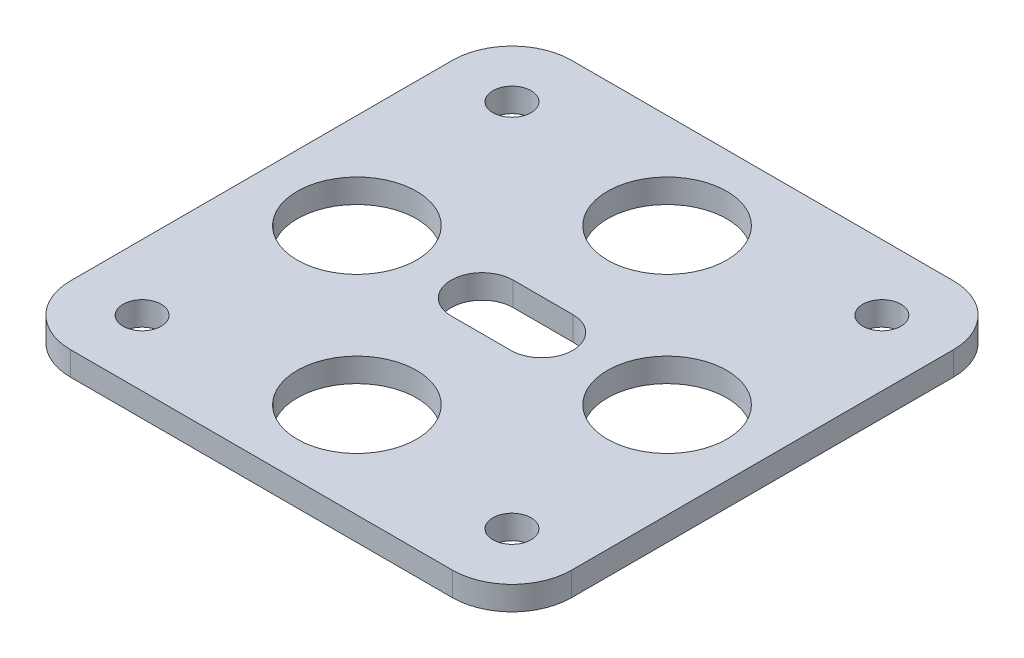
ISO-10303-21;
HEADER;
FILE_DESCRIPTION(('STEP AP214'),'2;1');
FILE_NAME('part.step','',(''),(''),'','','');
FILE_SCHEMA(('AUTOMOTIVE_DESIGN { 1 0 10303 214 1 1 1 1 }'));
ENDSEC;
DATA;
#1=APPLICATION_CONTEXT('core data for automotive mechanical design processes');
#2=APPLICATION_PROTOCOL_DEFINITION('international standard','automotive_design',2000,#1);
#3=PRODUCT_CONTEXT('',#1,'mechanical');
#4=PRODUCT('Part','Part','',(#3));
#5=PRODUCT_RELATED_PRODUCT_CATEGORY('part','',(#4));
#6=PRODUCT_DEFINITION_FORMATION('','',#4);
#7=PRODUCT_DEFINITION_CONTEXT('part definition',#1,'design');
#8=PRODUCT_DEFINITION('design','',#6,#7);
#9=PRODUCT_DEFINITION_SHAPE('','',#8);
#10=(LENGTH_UNIT() NAMED_UNIT(*) SI_UNIT(.MILLI.,.METRE.));
#11=(NAMED_UNIT(*) PLANE_ANGLE_UNIT() SI_UNIT($,.RADIAN.));
#12=(NAMED_UNIT(*) SI_UNIT($,.STERADIAN.) SOLID_ANGLE_UNIT());
#13=UNCERTAINTY_MEASURE_WITH_UNIT(LENGTH_MEASURE(1.E-05),#10,'distance_accuracy_value','');
#14=(GEOMETRIC_REPRESENTATION_CONTEXT(3) GLOBAL_UNCERTAINTY_ASSIGNED_CONTEXT((#13)) GLOBAL_UNIT_ASSIGNED_CONTEXT((#10,
#11,#12)) REPRESENTATION_CONTEXT('',''));
#15=CARTESIAN_POINT('',(0.,0.,0.));
#16=DIRECTION('',(0.,0.,1.));
#17=DIRECTION('',(1.,0.,0.));
#18=AXIS2_PLACEMENT_3D('',#15,#16,#17);
#19=CARTESIAN_POINT('',(0.,2.,0.));
#20=DIRECTION('',(0.,-1.,0.));
#21=DIRECTION('',(0.,0.,-1.));
#22=AXIS2_PLACEMENT_3D('',#19,#20,#21);
#23=PLANE('',#22);
#24=CARTESIAN_POINT('',(-15.5,2.,15.5));
#25=DIRECTION('',(0.,1.,0.));
#26=DIRECTION('',(0.,0.,1.));
#27=AXIS2_PLACEMENT_3D('',#24,#25,#26);
#28=CIRCLE('',#27,1.6);
#29=CARTESIAN_POINT('',(-15.5,2.,17.1));
#30=VERTEX_POINT('',#29);
#31=EDGE_CURVE('E167',#30,#30,#28,.T.);
#32=ORIENTED_EDGE('',*,*,#31,.F.);
#33=EDGE_LOOP('',(#32));
#34=FACE_BOUND('',#33,.T.);
#35=CARTESIAN_POINT('',(15.5,2.,15.5));
#36=DIRECTION('',(0.,1.,0.));
#37=DIRECTION('',(0.,0.,-1.));
#38=AXIS2_PLACEMENT_3D('',#35,#36,#37);
#39=CIRCLE('',#38,1.6);
#40=CARTESIAN_POINT('',(15.5,2.,13.9));
#41=VERTEX_POINT('',#40);
#42=EDGE_CURVE('E173',#41,#41,#39,.T.);
#43=ORIENTED_EDGE('',*,*,#42,.F.);
#44=EDGE_LOOP('',(#43));
#45=FACE_BOUND('',#44,.T.);
#46=CARTESIAN_POINT('',(-15.5,2.,-15.5));
#47=DIRECTION('',(0.,1.,0.));
#48=DIRECTION('',(0.,0.,-1.));
#49=AXIS2_PLACEMENT_3D('',#46,#47,#48);
#50=CIRCLE('',#49,1.6);
#51=CARTESIAN_POINT('',(-15.5,2.,-17.1));
#52=VERTEX_POINT('',#51);
#53=EDGE_CURVE('E179',#52,#52,#50,.T.);
#54=ORIENTED_EDGE('',*,*,#53,.F.);
#55=EDGE_LOOP('',(#54));
#56=FACE_BOUND('',#55,.T.);
#57=CARTESIAN_POINT('',(15.5,2.,-15.5));
#58=DIRECTION('',(0.,1.,0.));
#59=DIRECTION('',(0.,0.,1.));
#60=AXIS2_PLACEMENT_3D('',#57,#58,#59);
#61=CIRCLE('',#60,1.6);
#62=CARTESIAN_POINT('',(15.5,2.,-13.9));
#63=VERTEX_POINT('',#62);
#64=EDGE_CURVE('E185',#63,#63,#61,.T.);
#65=ORIENTED_EDGE('',*,*,#64,.F.);
#66=EDGE_LOOP('',(#65));
#67=FACE_BOUND('',#66,.T.);
#68=DIRECTION('',(-1.,0.,0.));
#69=VECTOR('',#68,1.);
#70=CARTESIAN_POINT('',(-21.,2.,-21.));
#71=LINE('',#70,#69);
#72=CARTESIAN_POINT('',(16.,2.,-21.));
#73=VERTEX_POINT('',#72);
#74=CARTESIAN_POINT('',(-16.,2.,-21.));
#75=VERTEX_POINT('',#74);
#76=EDGE_CURVE('E194',#73,#75,#71,.T.);
#77=ORIENTED_EDGE('',*,*,#76,.T.);
#78=CARTESIAN_POINT('',(-16.,2.,-16.));
#79=DIRECTION('',(0.,-1.,0.));
#80=DIRECTION('',(0.,0.,-1.));
#81=AXIS2_PLACEMENT_3D('',#78,#79,#80);
#82=CIRCLE('',#81,5.);
#83=CARTESIAN_POINT('',(-21.,2.,-16.));
#84=VERTEX_POINT('',#83);
#85=EDGE_CURVE('E234',#75,#84,#82,.F.);
#86=ORIENTED_EDGE('',*,*,#85,.T.);
#87=DIRECTION('',(0.,0.,1.));
#88=VECTOR('',#87,1.);
#89=CARTESIAN_POINT('',(-21.,2.,21.));
#90=LINE('',#89,#88);
#91=CARTESIAN_POINT('',(-21.,2.,16.));
#92=VERTEX_POINT('',#91);
#93=EDGE_CURVE('E198',#84,#92,#90,.T.);
#94=ORIENTED_EDGE('',*,*,#93,.T.);
#95=CARTESIAN_POINT('',(-16.,2.,16.));
#96=DIRECTION('',(0.,-1.,0.));
#97=DIRECTION('',(0.,0.,-1.));
#98=AXIS2_PLACEMENT_3D('',#95,#96,#97);
#99=CIRCLE('',#98,5.);
#100=CARTESIAN_POINT('',(-16.,2.,21.));
#101=VERTEX_POINT('',#100);
#102=EDGE_CURVE('E53',#92,#101,#99,.F.);
#103=ORIENTED_EDGE('',*,*,#102,.T.);
#104=DIRECTION('',(1.,0.,0.));
#105=VECTOR('',#104,1.);
#106=CARTESIAN_POINT('',(-21.,2.,21.));
#107=LINE('',#106,#105);
#108=CARTESIAN_POINT('',(16.,2.,21.));
#109=VERTEX_POINT('',#108);
#110=EDGE_CURVE('E200',#101,#109,#107,.T.);
#111=ORIENTED_EDGE('',*,*,#110,.T.);
#112=CARTESIAN_POINT('',(16.,2.,16.));
#113=DIRECTION('',(0.,-1.,0.));
#114=DIRECTION('',(0.,0.,-1.));
#115=AXIS2_PLACEMENT_3D('',#112,#113,#114);
#116=CIRCLE('',#115,5.);
#117=CARTESIAN_POINT('',(21.,2.,16.));
#118=VERTEX_POINT('',#117);
#119=EDGE_CURVE('E230',#109,#118,#116,.F.);
#120=ORIENTED_EDGE('',*,*,#119,.T.);
#121=DIRECTION('',(0.,0.,-1.));
#122=VECTOR('',#121,1.);
#123=CARTESIAN_POINT('',(21.,2.,21.));
#124=LINE('',#123,#122);
#125=CARTESIAN_POINT('',(21.,2.,-16.));
#126=VERTEX_POINT('',#125);
#127=EDGE_CURVE('E191',#118,#126,#124,.T.);
#128=ORIENTED_EDGE('',*,*,#127,.T.);
#129=CARTESIAN_POINT('',(16.,2.,-16.));
#130=DIRECTION('',(0.,-1.,0.));
#131=DIRECTION('',(0.,0.,-1.));
#132=AXIS2_PLACEMENT_3D('',#129,#130,#131);
#133=CIRCLE('',#132,5.);
#134=EDGE_CURVE('E232',#126,#73,#133,.F.);
#135=ORIENTED_EDGE('',*,*,#134,.T.);
#136=EDGE_LOOP('',(#77,#86,#94,#103,#111,#120,#128,#135));
#137=FACE_BOUND('',#136,.T.);
#138=CARTESIAN_POINT('',(-2.49999999999999,2.,0.));
#139=DIRECTION('',(0.,1.,0.));
#140=DIRECTION('',(0.,0.,1.));
#141=AXIS2_PLACEMENT_3D('',#138,#139,#140);
#142=CIRCLE('',#141,2.6);
#143=CARTESIAN_POINT('',(-2.5,2.,-2.6));
#144=VERTEX_POINT('',#143);
#145=CARTESIAN_POINT('',(-2.5,2.,2.6));
#146=VERTEX_POINT('',#145);
#147=EDGE_CURVE('E123',#144,#146,#142,.T.);
#148=ORIENTED_EDGE('',*,*,#147,.F.);
#149=DIRECTION('',(-1.,0.,0.));
#150=VECTOR('',#149,1.);
#151=CARTESIAN_POINT('',(-2.5,2.,-2.6));
#152=LINE('',#151,#150);
#153=CARTESIAN_POINT('',(2.5,2.,-2.6));
#154=VERTEX_POINT('',#153);
#155=EDGE_CURVE('E149',#154,#144,#152,.T.);
#156=ORIENTED_EDGE('',*,*,#155,.F.);
#157=CARTESIAN_POINT('',(2.5,2.,0.));
#158=DIRECTION('',(0.,1.,0.));
#159=DIRECTION('',(0.,0.,1.));
#160=AXIS2_PLACEMENT_3D('',#157,#158,#159);
#161=CIRCLE('',#160,2.6);
#162=CARTESIAN_POINT('',(2.5,2.,2.6));
#163=VERTEX_POINT('',#162);
#164=EDGE_CURVE('E147',#163,#154,#161,.T.);
#165=ORIENTED_EDGE('',*,*,#164,.F.);
#166=DIRECTION('',(1.,0.,0.));
#167=VECTOR('',#166,1.);
#168=CARTESIAN_POINT('',(-2.5,2.,2.6));
#169=LINE('',#168,#167);
#170=EDGE_CURVE('E133',#146,#163,#169,.T.);
#171=ORIENTED_EDGE('',*,*,#170,.F.);
#172=EDGE_LOOP('',(#148,#156,#165,#171));
#173=FACE_BOUND('',#172,.T.);
#174=CARTESIAN_POINT('',(0.,2.,-13.));
#175=DIRECTION('',(0.,1.,0.));
#176=DIRECTION('',(0.,0.,1.));
#177=AXIS2_PLACEMENT_3D('',#174,#175,#176);
#178=CIRCLE('',#177,5.);
#179=CARTESIAN_POINT('',(0.,2.,-8.));
#180=VERTEX_POINT('',#179);
#181=EDGE_CURVE('E156',#180,#180,#178,.T.);
#182=ORIENTED_EDGE('',*,*,#181,.F.);
#183=EDGE_LOOP('',(#182));
#184=FACE_BOUND('',#183,.T.);
#185=CARTESIAN_POINT('',(13.0000000000003,2.,-3.39652169345829E-13));
#186=DIRECTION('',(0.,1.,0.));
#187=DIRECTION('',(0.,0.,1.));
#188=AXIS2_PLACEMENT_3D('',#185,#186,#187);
#189=CIRCLE('',#188,5.);
#190=CARTESIAN_POINT('',(13.0000000000003,2.,4.99999999999966));
#191=VERTEX_POINT('',#190);
#192=EDGE_CURVE('E505',#191,#191,#189,.T.);
#193=ORIENTED_EDGE('',*,*,#192,.F.);
#194=EDGE_LOOP('',(#193));
#195=FACE_BOUND('',#194,.T.);
#196=CARTESIAN_POINT('',(6.79304338691657E-13,2.,13.));
#197=DIRECTION('',(0.,1.,0.));
#198=DIRECTION('',(0.,0.,1.));
#199=AXIS2_PLACEMENT_3D('',#196,#197,#198);
#200=CIRCLE('',#199,5.);
#201=CARTESIAN_POINT('',(6.79304338691657E-13,2.,18.));
#202=VERTEX_POINT('',#201);
#203=EDGE_CURVE('E500',#202,#202,#200,.T.);
#204=ORIENTED_EDGE('',*,*,#203,.F.);
#205=EDGE_LOOP('',(#204));
#206=FACE_BOUND('',#205,.T.);
#207=CARTESIAN_POINT('',(-12.9999999999997,2.,3.4124421018472E-13));
#208=DIRECTION('',(0.,1.,0.));
#209=DIRECTION('',(0.,0.,1.));
#210=AXIS2_PLACEMENT_3D('',#207,#208,#209);
#211=CIRCLE('',#210,5.);
#212=CARTESIAN_POINT('',(-12.9999999999997,2.,5.00000000000034));
#213=VERTEX_POINT('',#212);
#214=EDGE_CURVE('E494',#213,#213,#211,.T.);
#215=ORIENTED_EDGE('',*,*,#214,.F.);
#216=EDGE_LOOP('',(#215));
#217=FACE_BOUND('',#216,.T.);
#218=ADVANCED_FACE('F33',(#34,#45,#56,#67,#137,#173,#184,#195,#206,#217),#23,.F.);
#219=CARTESIAN_POINT('',(0.,0.,0.));
#220=DIRECTION('',(0.,-1.,0.));
#221=DIRECTION('',(0.,0.,-1.));
#222=AXIS2_PLACEMENT_3D('',#219,#220,#221);
#223=PLANE('',#222);
#224=CARTESIAN_POINT('',(6.79304338691657E-13,0.,13.));
#225=DIRECTION('',(0.,1.,0.));
#226=DIRECTION('',(0.,0.,1.));
#227=AXIS2_PLACEMENT_3D('',#224,#225,#226);
#228=CIRCLE('',#227,5.);
#229=CARTESIAN_POINT('',(6.79304338691657E-13,0.,18.));
#230=VERTEX_POINT('',#229);
#231=EDGE_CURVE('E497',#230,#230,#228,.T.);
#232=ORIENTED_EDGE('',*,*,#231,.T.);
#233=EDGE_LOOP('',(#232));
#234=FACE_BOUND('',#233,.T.);
#235=CARTESIAN_POINT('',(0.,0.,-13.));
#236=DIRECTION('',(0.,1.,0.));
#237=DIRECTION('',(0.,0.,1.));
#238=AXIS2_PLACEMENT_3D('',#235,#236,#237);
#239=CIRCLE('',#238,5.);
#240=CARTESIAN_POINT('',(0.,0.,-8.));
#241=VERTEX_POINT('',#240);
#242=EDGE_CURVE('E508',#241,#241,#239,.T.);
#243=ORIENTED_EDGE('',*,*,#242,.T.);
#244=EDGE_LOOP('',(#243));
#245=FACE_BOUND('',#244,.T.);
#246=CARTESIAN_POINT('',(15.5,0.,15.5));
#247=DIRECTION('',(0.,1.,0.));
#248=DIRECTION('',(0.,0.,-1.));
#249=AXIS2_PLACEMENT_3D('',#246,#247,#248);
#250=CIRCLE('',#249,1.6);
#251=CARTESIAN_POINT('',(15.5,0.,13.9));
#252=VERTEX_POINT('',#251);
#253=EDGE_CURVE('E170',#252,#252,#250,.T.);
#254=ORIENTED_EDGE('',*,*,#253,.T.);
#255=EDGE_LOOP('',(#254));
#256=FACE_BOUND('',#255,.T.);
#257=CARTESIAN_POINT('',(15.5,0.,-15.5));
#258=DIRECTION('',(0.,1.,0.));
#259=DIRECTION('',(0.,0.,1.));
#260=AXIS2_PLACEMENT_3D('',#257,#258,#259);
#261=CIRCLE('',#260,1.6);
#262=CARTESIAN_POINT('',(15.5,0.,-13.9));
#263=VERTEX_POINT('',#262);
#264=EDGE_CURVE('E182',#263,#263,#261,.T.);
#265=ORIENTED_EDGE('',*,*,#264,.T.);
#266=EDGE_LOOP('',(#265));
#267=FACE_BOUND('',#266,.T.);
#268=DIRECTION('',(0.,0.,1.));
#269=VECTOR('',#268,1.);
#270=CARTESIAN_POINT('',(-21.,0.,21.));
#271=LINE('',#270,#269);
#272=CARTESIAN_POINT('',(-21.,0.,-16.));
#273=VERTEX_POINT('',#272);
#274=CARTESIAN_POINT('',(-21.,0.,16.));
#275=VERTEX_POINT('',#274);
#276=EDGE_CURVE('E208',#273,#275,#271,.T.);
#277=ORIENTED_EDGE('',*,*,#276,.F.);
#278=CARTESIAN_POINT('',(-16.,0.,-16.));
#279=DIRECTION('',(0.,-1.,0.));
#280=DIRECTION('',(0.,0.,-1.));
#281=AXIS2_PLACEMENT_3D('',#278,#279,#280);
#282=CIRCLE('',#281,5.);
#283=CARTESIAN_POINT('',(-16.,0.,-21.));
#284=VERTEX_POINT('',#283);
#285=EDGE_CURVE('E222',#273,#284,#282,.T.);
#286=ORIENTED_EDGE('',*,*,#285,.T.);
#287=DIRECTION('',(-1.,0.,0.));
#288=VECTOR('',#287,1.);
#289=CARTESIAN_POINT('',(-21.,0.,-21.));
#290=LINE('',#289,#288);
#291=CARTESIAN_POINT('',(16.,0.,-21.));
#292=VERTEX_POINT('',#291);
#293=EDGE_CURVE('E205',#292,#284,#290,.T.);
#294=ORIENTED_EDGE('',*,*,#293,.F.);
#295=CARTESIAN_POINT('',(16.,0.,-16.));
#296=DIRECTION('',(0.,-1.,0.));
#297=DIRECTION('',(0.,0.,-1.));
#298=AXIS2_PLACEMENT_3D('',#295,#296,#297);
#299=CIRCLE('',#298,5.);
#300=CARTESIAN_POINT('',(21.,0.,-16.));
#301=VERTEX_POINT('',#300);
#302=EDGE_CURVE('E220',#292,#301,#299,.T.);
#303=ORIENTED_EDGE('',*,*,#302,.T.);
#304=DIRECTION('',(0.,0.,-1.));
#305=VECTOR('',#304,1.);
#306=CARTESIAN_POINT('',(21.,0.,21.));
#307=LINE('',#306,#305);
#308=CARTESIAN_POINT('',(21.,0.,16.));
#309=VERTEX_POINT('',#308);
#310=EDGE_CURVE('E188',#309,#301,#307,.T.);
#311=ORIENTED_EDGE('',*,*,#310,.F.);
#312=CARTESIAN_POINT('',(16.,0.,16.));
#313=DIRECTION('',(0.,-1.,0.));
#314=DIRECTION('',(0.,0.,-1.));
#315=AXIS2_PLACEMENT_3D('',#312,#313,#314);
#316=CIRCLE('',#315,5.);
#317=CARTESIAN_POINT('',(16.,0.,21.));
#318=VERTEX_POINT('',#317);
#319=EDGE_CURVE('E218',#309,#318,#316,.T.);
#320=ORIENTED_EDGE('',*,*,#319,.T.);
#321=DIRECTION('',(1.,0.,0.));
#322=VECTOR('',#321,1.);
#323=CARTESIAN_POINT('',(-21.,0.,21.));
#324=LINE('',#323,#322);
#325=CARTESIAN_POINT('',(-16.,0.,21.));
#326=VERTEX_POINT('',#325);
#327=EDGE_CURVE('E195',#326,#318,#324,.T.);
#328=ORIENTED_EDGE('',*,*,#327,.F.);
#329=CARTESIAN_POINT('',(-16.,0.,16.));
#330=DIRECTION('',(0.,-1.,0.));
#331=DIRECTION('',(0.,0.,-1.));
#332=AXIS2_PLACEMENT_3D('',#329,#330,#331);
#333=CIRCLE('',#332,5.);
#334=EDGE_CURVE('E216',#326,#275,#333,.T.);
#335=ORIENTED_EDGE('',*,*,#334,.T.);
#336=EDGE_LOOP('',(#277,#286,#294,#303,#311,#320,#328,#335));
#337=FACE_BOUND('',#336,.T.);
#338=CARTESIAN_POINT('',(-15.5,0.,-15.5));
#339=DIRECTION('',(0.,1.,0.));
#340=DIRECTION('',(0.,0.,-1.));
#341=AXIS2_PLACEMENT_3D('',#338,#339,#340);
#342=CIRCLE('',#341,1.6);
#343=CARTESIAN_POINT('',(-15.5,0.,-17.1));
#344=VERTEX_POINT('',#343);
#345=EDGE_CURVE('E176',#344,#344,#342,.T.);
#346=ORIENTED_EDGE('',*,*,#345,.T.);
#347=EDGE_LOOP('',(#346));
#348=FACE_BOUND('',#347,.T.);
#349=CARTESIAN_POINT('',(-15.5,0.,15.5));
#350=DIRECTION('',(0.,1.,0.));
#351=DIRECTION('',(0.,0.,1.));
#352=AXIS2_PLACEMENT_3D('',#349,#350,#351);
#353=CIRCLE('',#352,1.6);
#354=CARTESIAN_POINT('',(-15.5,0.,17.1));
#355=VERTEX_POINT('',#354);
#356=EDGE_CURVE('E141',#355,#355,#353,.T.);
#357=ORIENTED_EDGE('',*,*,#356,.T.);
#358=EDGE_LOOP('',(#357));
#359=FACE_BOUND('',#358,.T.);
#360=DIRECTION('',(-1.,0.,0.));
#361=VECTOR('',#360,1.);
#362=CARTESIAN_POINT('',(-2.5,0.,-2.6));
#363=LINE('',#362,#361);
#364=CARTESIAN_POINT('',(2.5,0.,-2.6));
#365=VERTEX_POINT('',#364);
#366=CARTESIAN_POINT('',(-2.5,0.,-2.6));
#367=VERTEX_POINT('',#366);
#368=EDGE_CURVE('E134',#365,#367,#363,.T.);
#369=ORIENTED_EDGE('',*,*,#368,.T.);
#370=CARTESIAN_POINT('',(-2.49999999999999,0.,0.));
#371=DIRECTION('',(0.,1.,0.));
#372=DIRECTION('',(0.,0.,1.));
#373=AXIS2_PLACEMENT_3D('',#370,#371,#372);
#374=CIRCLE('',#373,2.6);
#375=CARTESIAN_POINT('',(-2.5,0.,2.6));
#376=VERTEX_POINT('',#375);
#377=EDGE_CURVE('E154',#367,#376,#374,.T.);
#378=ORIENTED_EDGE('',*,*,#377,.T.);
#379=DIRECTION('',(1.,0.,0.));
#380=VECTOR('',#379,1.);
#381=CARTESIAN_POINT('',(-2.5,0.,2.6));
#382=LINE('',#381,#380);
#383=CARTESIAN_POINT('',(2.5,0.,2.6));
#384=VERTEX_POINT('',#383);
#385=EDGE_CURVE('E140',#376,#384,#382,.T.);
#386=ORIENTED_EDGE('',*,*,#385,.T.);
#387=CARTESIAN_POINT('',(2.5,0.,0.));
#388=DIRECTION('',(0.,1.,0.));
#389=DIRECTION('',(0.,0.,1.));
#390=AXIS2_PLACEMENT_3D('',#387,#388,#389);
#391=CIRCLE('',#390,2.6);
#392=EDGE_CURVE('E158',#384,#365,#391,.T.);
#393=ORIENTED_EDGE('',*,*,#392,.T.);
#394=EDGE_LOOP('',(#369,#378,#386,#393));
#395=FACE_BOUND('',#394,.T.);
#396=CARTESIAN_POINT('',(13.0000000000003,0.,-3.39652169345829E-13));
#397=DIRECTION('',(0.,1.,0.));
#398=DIRECTION('',(0.,0.,1.));
#399=AXIS2_PLACEMENT_3D('',#396,#397,#398);
#400=CIRCLE('',#399,5.);
#401=CARTESIAN_POINT('',(13.0000000000003,0.,4.99999999999966));
#402=VERTEX_POINT('',#401);
#403=EDGE_CURVE('E489',#402,#402,#400,.T.);
#404=ORIENTED_EDGE('',*,*,#403,.T.);
#405=EDGE_LOOP('',(#404));
#406=FACE_BOUND('',#405,.T.);
#407=CARTESIAN_POINT('',(-12.9999999999997,0.,3.4124421018472E-13));
#408=DIRECTION('',(0.,1.,0.));
#409=DIRECTION('',(0.,0.,1.));
#410=AXIS2_PLACEMENT_3D('',#407,#408,#409);
#411=CIRCLE('',#410,5.);
#412=CARTESIAN_POINT('',(-12.9999999999997,0.,5.00000000000034));
#413=VERTEX_POINT('',#412);
#414=EDGE_CURVE('E492',#413,#413,#411,.T.);
#415=ORIENTED_EDGE('',*,*,#414,.T.);
#416=EDGE_LOOP('',(#415));
#417=FACE_BOUND('',#416,.T.);
#418=ADVANCED_FACE('F247',(#234,#245,#256,#267,#337,#348,#359,#395,#406,#417),#223,.T.);
#419=CARTESIAN_POINT('',(21.,2.,21.));
#420=DIRECTION('',(-1.,0.,0.));
#421=DIRECTION('',(0.,0.,1.));
#422=AXIS2_PLACEMENT_3D('',#419,#420,#421);
#423=PLANE('',#422);
#424=ORIENTED_EDGE('',*,*,#310,.T.);
#425=DIRECTION('',(0.,-1.,0.));
#426=VECTOR('',#425,1.);
#427=CARTESIAN_POINT('',(21.,2.,-16.));
#428=LINE('',#427,#426);
#429=EDGE_CURVE('E239',#301,#126,#428,.F.);
#430=ORIENTED_EDGE('',*,*,#429,.T.);
#431=ORIENTED_EDGE('',*,*,#127,.F.);
#432=DIRECTION('',(0.,-1.,0.));
#433=VECTOR('',#432,1.);
#434=CARTESIAN_POINT('',(21.,2.,16.));
#435=LINE('',#434,#433);
#436=EDGE_CURVE('E236',#118,#309,#435,.T.);
#437=ORIENTED_EDGE('',*,*,#436,.T.);
#438=EDGE_LOOP('',(#424,#430,#431,#437));
#439=FACE_BOUND('',#438,.T.);
#440=ADVANCED_FACE('F256',(#439),#423,.F.);
#441=CARTESIAN_POINT('',(-21.,2.,-21.));
#442=DIRECTION('',(0.,0.,1.));
#443=DIRECTION('',(1.,0.,0.));
#444=AXIS2_PLACEMENT_3D('',#441,#442,#443);
#445=PLANE('',#444);
#446=ORIENTED_EDGE('',*,*,#293,.T.);
#447=DIRECTION('',(0.,-1.,0.));
#448=VECTOR('',#447,1.);
#449=CARTESIAN_POINT('',(-16.,2.,-21.));
#450=LINE('',#449,#448);
#451=EDGE_CURVE('E227',#284,#75,#450,.F.);
#452=ORIENTED_EDGE('',*,*,#451,.T.);
#453=ORIENTED_EDGE('',*,*,#76,.F.);
#454=DIRECTION('',(0.,-1.,0.));
#455=VECTOR('',#454,1.);
#456=CARTESIAN_POINT('',(16.,2.,-21.));
#457=LINE('',#456,#455);
#458=EDGE_CURVE('E224',#73,#292,#457,.T.);
#459=ORIENTED_EDGE('',*,*,#458,.T.);
#460=EDGE_LOOP('',(#446,#452,#453,#459));
#461=FACE_BOUND('',#460,.T.);
#462=ADVANCED_FACE('F265',(#461),#445,.F.);
#463=CARTESIAN_POINT('',(-21.,2.,21.));
#464=DIRECTION('',(1.,0.,0.));
#465=DIRECTION('',(0.,0.,-1.));
#466=AXIS2_PLACEMENT_3D('',#463,#464,#465);
#467=PLANE('',#466);
#468=ORIENTED_EDGE('',*,*,#93,.F.);
#469=DIRECTION('',(0.,-1.,0.));
#470=VECTOR('',#469,1.);
#471=CARTESIAN_POINT('',(-21.,2.,-16.));
#472=LINE('',#471,#470);
#473=EDGE_CURVE('E213',#84,#273,#472,.T.);
#474=ORIENTED_EDGE('',*,*,#473,.T.);
#475=ORIENTED_EDGE('',*,*,#276,.T.);
#476=DIRECTION('',(0.,-1.,0.));
#477=VECTOR('',#476,1.);
#478=CARTESIAN_POINT('',(-21.,2.,16.));
#479=LINE('',#478,#477);
#480=EDGE_CURVE('E202',#275,#92,#479,.F.);
#481=ORIENTED_EDGE('',*,*,#480,.T.);
#482=EDGE_LOOP('',(#468,#474,#475,#481));
#483=FACE_BOUND('',#482,.T.);
#484=ADVANCED_FACE('F273',(#483),#467,.F.);
#485=CARTESIAN_POINT('',(-21.,2.,21.));
#486=DIRECTION('',(0.,0.,-1.));
#487=DIRECTION('',(-1.,0.,0.));
#488=AXIS2_PLACEMENT_3D('',#485,#486,#487);
#489=PLANE('',#488);
#490=ORIENTED_EDGE('',*,*,#327,.T.);
#491=DIRECTION('',(0.,-1.,0.));
#492=VECTOR('',#491,1.);
#493=CARTESIAN_POINT('',(16.,2.,21.));
#494=LINE('',#493,#492);
#495=EDGE_CURVE('E11',#318,#109,#494,.F.);
#496=ORIENTED_EDGE('',*,*,#495,.T.);
#497=ORIENTED_EDGE('',*,*,#110,.F.);
#498=DIRECTION('',(0.,-1.,0.));
#499=VECTOR('',#498,1.);
#500=CARTESIAN_POINT('',(-16.,2.,21.));
#501=LINE('',#500,#499);
#502=EDGE_CURVE('E41',#101,#326,#501,.T.);
#503=ORIENTED_EDGE('',*,*,#502,.T.);
#504=EDGE_LOOP('',(#490,#496,#497,#503));
#505=FACE_BOUND('',#504,.T.);
#506=ADVANCED_FACE('F243',(#505),#489,.F.);
#507=CARTESIAN_POINT('',(15.5,2.,-15.5));
#508=DIRECTION('',(0.,-1.,0.));
#509=DIRECTION('',(0.,0.,-1.));
#510=AXIS2_PLACEMENT_3D('',#507,#508,#509);
#511=CYLINDRICAL_SURFACE('',#510,1.6);
#512=ORIENTED_EDGE('',*,*,#64,.T.);
#513=EDGE_LOOP('',(#512));
#514=FACE_BOUND('',#513,.T.);
#515=ORIENTED_EDGE('',*,*,#264,.F.);
#516=EDGE_LOOP('',(#515));
#517=FACE_BOUND('',#516,.T.);
#518=ADVANCED_FACE('F290',(#514,#517),#511,.F.);
#519=CARTESIAN_POINT('',(-15.5,2.,-15.5));
#520=DIRECTION('',(0.,-1.,0.));
#521=DIRECTION('',(0.,0.,-1.));
#522=AXIS2_PLACEMENT_3D('',#519,#520,#521);
#523=CYLINDRICAL_SURFACE('',#522,1.6);
#524=ORIENTED_EDGE('',*,*,#53,.T.);
#525=EDGE_LOOP('',(#524));
#526=FACE_BOUND('',#525,.T.);
#527=ORIENTED_EDGE('',*,*,#345,.F.);
#528=EDGE_LOOP('',(#527));
#529=FACE_BOUND('',#528,.T.);
#530=ADVANCED_FACE('F411',(#526,#529),#523,.F.);
#531=CARTESIAN_POINT('',(15.5,2.,15.5));
#532=DIRECTION('',(0.,-1.,0.));
#533=DIRECTION('',(0.,0.,-1.));
#534=AXIS2_PLACEMENT_3D('',#531,#532,#533);
#535=CYLINDRICAL_SURFACE('',#534,1.6);
#536=ORIENTED_EDGE('',*,*,#42,.T.);
#537=EDGE_LOOP('',(#536));
#538=FACE_BOUND('',#537,.T.);
#539=ORIENTED_EDGE('',*,*,#253,.F.);
#540=EDGE_LOOP('',(#539));
#541=FACE_BOUND('',#540,.T.);
#542=ADVANCED_FACE('F402',(#538,#541),#535,.F.);
#543=CARTESIAN_POINT('',(-15.5,2.,15.5));
#544=DIRECTION('',(0.,-1.,0.));
#545=DIRECTION('',(0.,0.,-1.));
#546=AXIS2_PLACEMENT_3D('',#543,#544,#545);
#547=CYLINDRICAL_SURFACE('',#546,1.6);
#548=ORIENTED_EDGE('',*,*,#31,.T.);
#549=EDGE_LOOP('',(#548));
#550=FACE_BOUND('',#549,.T.);
#551=ORIENTED_EDGE('',*,*,#356,.F.);
#552=EDGE_LOOP('',(#551));
#553=FACE_BOUND('',#552,.T.);
#554=ADVANCED_FACE('F394',(#550,#553),#547,.F.);
#555=CARTESIAN_POINT('',(-2.49999999999999,2.,0.));
#556=DIRECTION('',(0.,-1.,0.));
#557=DIRECTION('',(0.,0.,-1.));
#558=AXIS2_PLACEMENT_3D('',#555,#556,#557);
#559=CYLINDRICAL_SURFACE('',#558,2.6);
#560=ORIENTED_EDGE('',*,*,#377,.F.);
#561=DIRECTION('',(0.,-1.,0.));
#562=VECTOR('',#561,1.);
#563=CARTESIAN_POINT('',(-2.5,2.,-2.6));
#564=LINE('',#563,#562);
#565=EDGE_CURVE('E129',#144,#367,#564,.T.);
#566=ORIENTED_EDGE('',*,*,#565,.F.);
#567=ORIENTED_EDGE('',*,*,#147,.T.);
#568=DIRECTION('',(0.,-1.,0.));
#569=VECTOR('',#568,1.);
#570=CARTESIAN_POINT('',(-2.5,2.,2.6));
#571=LINE('',#570,#569);
#572=EDGE_CURVE('E126',#146,#376,#571,.T.);
#573=ORIENTED_EDGE('',*,*,#572,.T.);
#574=EDGE_LOOP('',(#560,#566,#567,#573));
#575=FACE_BOUND('',#574,.T.);
#576=ADVANCED_FACE('F125',(#575),#559,.F.);
#577=CARTESIAN_POINT('',(-2.5,2.,2.6));
#578=DIRECTION('',(0.,0.,-1.));
#579=DIRECTION('',(-1.,0.,0.));
#580=AXIS2_PLACEMENT_3D('',#577,#578,#579);
#581=PLANE('',#580);
#582=ORIENTED_EDGE('',*,*,#385,.F.);
#583=ORIENTED_EDGE('',*,*,#572,.F.);
#584=ORIENTED_EDGE('',*,*,#170,.T.);
#585=DIRECTION('',(0.,-1.,0.));
#586=VECTOR('',#585,1.);
#587=CARTESIAN_POINT('',(2.5,2.,2.6));
#588=LINE('',#587,#586);
#589=EDGE_CURVE('E142',#163,#384,#588,.T.);
#590=ORIENTED_EDGE('',*,*,#589,.T.);
#591=EDGE_LOOP('',(#582,#583,#584,#590));
#592=FACE_BOUND('',#591,.T.);
#593=ADVANCED_FACE('F137',(#592),#581,.T.);
#594=CARTESIAN_POINT('',(2.5,2.,0.));
#595=DIRECTION('',(0.,-1.,0.));
#596=DIRECTION('',(0.,0.,-1.));
#597=AXIS2_PLACEMENT_3D('',#594,#595,#596);
#598=CYLINDRICAL_SURFACE('',#597,2.6);
#599=ORIENTED_EDGE('',*,*,#392,.F.);
#600=ORIENTED_EDGE('',*,*,#589,.F.);
#601=ORIENTED_EDGE('',*,*,#164,.T.);
#602=DIRECTION('',(0.,-1.,0.));
#603=VECTOR('',#602,1.);
#604=CARTESIAN_POINT('',(2.5,2.,-2.6));
#605=LINE('',#604,#603);
#606=EDGE_CURVE('E164',#154,#365,#605,.T.);
#607=ORIENTED_EDGE('',*,*,#606,.T.);
#608=EDGE_LOOP('',(#599,#600,#601,#607));
#609=FACE_BOUND('',#608,.T.);
#610=ADVANCED_FACE('F370',(#609),#598,.F.);
#611=CARTESIAN_POINT('',(-2.5,2.,-2.6));
#612=DIRECTION('',(0.,0.,1.));
#613=DIRECTION('',(1.,0.,0.));
#614=AXIS2_PLACEMENT_3D('',#611,#612,#613);
#615=PLANE('',#614);
#616=ORIENTED_EDGE('',*,*,#368,.F.);
#617=ORIENTED_EDGE('',*,*,#606,.F.);
#618=ORIENTED_EDGE('',*,*,#155,.T.);
#619=ORIENTED_EDGE('',*,*,#565,.T.);
#620=EDGE_LOOP('',(#616,#617,#618,#619));
#621=FACE_BOUND('',#620,.T.);
#622=ADVANCED_FACE('F361',(#621),#615,.T.);
#623=CARTESIAN_POINT('',(0.,2.,-13.));
#624=DIRECTION('',(0.,-1.,0.));
#625=DIRECTION('',(0.,0.,-1.));
#626=AXIS2_PLACEMENT_3D('',#623,#624,#625);
#627=CYLINDRICAL_SURFACE('',#626,5.);
#628=ORIENTED_EDGE('',*,*,#181,.T.);
#629=EDGE_LOOP('',(#628));
#630=FACE_BOUND('',#629,.T.);
#631=ORIENTED_EDGE('',*,*,#242,.F.);
#632=EDGE_LOOP('',(#631));
#633=FACE_BOUND('',#632,.T.);
#634=ADVANCED_FACE('F352',(#630,#633),#627,.F.);
#635=CARTESIAN_POINT('',(13.0000000000003,2.,-3.39652169345829E-13));
#636=DIRECTION('',(0.,-1.,0.));
#637=DIRECTION('',(0.,0.,-1.));
#638=AXIS2_PLACEMENT_3D('',#635,#636,#637);
#639=CYLINDRICAL_SURFACE('',#638,5.);
#640=ORIENTED_EDGE('',*,*,#192,.T.);
#641=EDGE_LOOP('',(#640));
#642=FACE_BOUND('',#641,.T.);
#643=ORIENTED_EDGE('',*,*,#403,.F.);
#644=EDGE_LOOP('',(#643));
#645=FACE_BOUND('',#644,.T.);
#646=ADVANCED_FACE('F343',(#642,#645),#639,.F.);
#647=CARTESIAN_POINT('',(6.79304338691657E-13,2.,13.));
#648=DIRECTION('',(0.,-1.,0.));
#649=DIRECTION('',(0.,0.,-1.));
#650=AXIS2_PLACEMENT_3D('',#647,#648,#649);
#651=CYLINDRICAL_SURFACE('',#650,5.);
#652=ORIENTED_EDGE('',*,*,#203,.T.);
#653=EDGE_LOOP('',(#652));
#654=FACE_BOUND('',#653,.T.);
#655=ORIENTED_EDGE('',*,*,#231,.F.);
#656=EDGE_LOOP('',(#655));
#657=FACE_BOUND('',#656,.T.);
#658=ADVANCED_FACE('F334',(#654,#657),#651,.F.);
#659=CARTESIAN_POINT('',(-12.9999999999997,2.,3.4124421018472E-13));
#660=DIRECTION('',(0.,-1.,0.));
#661=DIRECTION('',(0.,0.,-1.));
#662=AXIS2_PLACEMENT_3D('',#659,#660,#661);
#663=CYLINDRICAL_SURFACE('',#662,5.);
#664=ORIENTED_EDGE('',*,*,#214,.T.);
#665=EDGE_LOOP('',(#664));
#666=FACE_BOUND('',#665,.T.);
#667=ORIENTED_EDGE('',*,*,#414,.F.);
#668=EDGE_LOOP('',(#667));
#669=FACE_BOUND('',#668,.T.);
#670=ADVANCED_FACE('F303',(#666,#669),#663,.F.);
#671=CARTESIAN_POINT('',(-16.,2.,-16.));
#672=DIRECTION('',(0.,-1.,0.));
#673=DIRECTION('',(0.,0.,-1.));
#674=AXIS2_PLACEMENT_3D('',#671,#672,#673);
#675=CYLINDRICAL_SURFACE('',#674,5.);
#676=ORIENTED_EDGE('',*,*,#85,.F.);
#677=ORIENTED_EDGE('',*,*,#451,.F.);
#678=ORIENTED_EDGE('',*,*,#285,.F.);
#679=ORIENTED_EDGE('',*,*,#473,.F.);
#680=EDGE_LOOP('',(#676,#677,#678,#679));
#681=FACE_BOUND('',#680,.T.);
#682=ADVANCED_FACE('F270',(#681),#675,.T.);
#683=CARTESIAN_POINT('',(16.,2.,-16.));
#684=DIRECTION('',(0.,-1.,0.));
#685=DIRECTION('',(0.,0.,-1.));
#686=AXIS2_PLACEMENT_3D('',#683,#684,#685);
#687=CYLINDRICAL_SURFACE('',#686,5.);
#688=ORIENTED_EDGE('',*,*,#134,.F.);
#689=ORIENTED_EDGE('',*,*,#429,.F.);
#690=ORIENTED_EDGE('',*,*,#302,.F.);
#691=ORIENTED_EDGE('',*,*,#458,.F.);
#692=EDGE_LOOP('',(#688,#689,#690,#691));
#693=FACE_BOUND('',#692,.T.);
#694=ADVANCED_FACE('F262',(#693),#687,.T.);
#695=CARTESIAN_POINT('',(16.,2.,16.));
#696=DIRECTION('',(0.,-1.,0.));
#697=DIRECTION('',(0.,0.,-1.));
#698=AXIS2_PLACEMENT_3D('',#695,#696,#697);
#699=CYLINDRICAL_SURFACE('',#698,5.);
#700=ORIENTED_EDGE('',*,*,#119,.F.);
#701=ORIENTED_EDGE('',*,*,#495,.F.);
#702=ORIENTED_EDGE('',*,*,#319,.F.);
#703=ORIENTED_EDGE('',*,*,#436,.F.);
#704=EDGE_LOOP('',(#700,#701,#702,#703));
#705=FACE_BOUND('',#704,.T.);
#706=ADVANCED_FACE('F253',(#705),#699,.T.);
#707=CARTESIAN_POINT('',(-16.,2.,16.));
#708=DIRECTION('',(0.,-1.,0.));
#709=DIRECTION('',(0.,0.,-1.));
#710=AXIS2_PLACEMENT_3D('',#707,#708,#709);
#711=CYLINDRICAL_SURFACE('',#710,5.);
#712=ORIENTED_EDGE('',*,*,#102,.F.);
#713=ORIENTED_EDGE('',*,*,#480,.F.);
#714=ORIENTED_EDGE('',*,*,#334,.F.);
#715=ORIENTED_EDGE('',*,*,#502,.F.);
#716=EDGE_LOOP('',(#712,#713,#714,#715));
#717=FACE_BOUND('',#716,.T.);
#718=ADVANCED_FACE('F35',(#717),#711,.T.);
#719=CLOSED_SHELL('',(#218,#418,#440,#462,#484,#506,#518,#530,#542,#554,#576,#593,#610,#622,
#634,#646,#658,#670,#682,#694,#706,#718));
#720=MANIFOLD_SOLID_BREP('B2',#719);
#721=ADVANCED_BREP_SHAPE_REPRESENTATION('',(#18,#720),#14);
#722=SHAPE_DEFINITION_REPRESENTATION(#9,#721);
ENDSEC;
END-ISO-10303-21;
